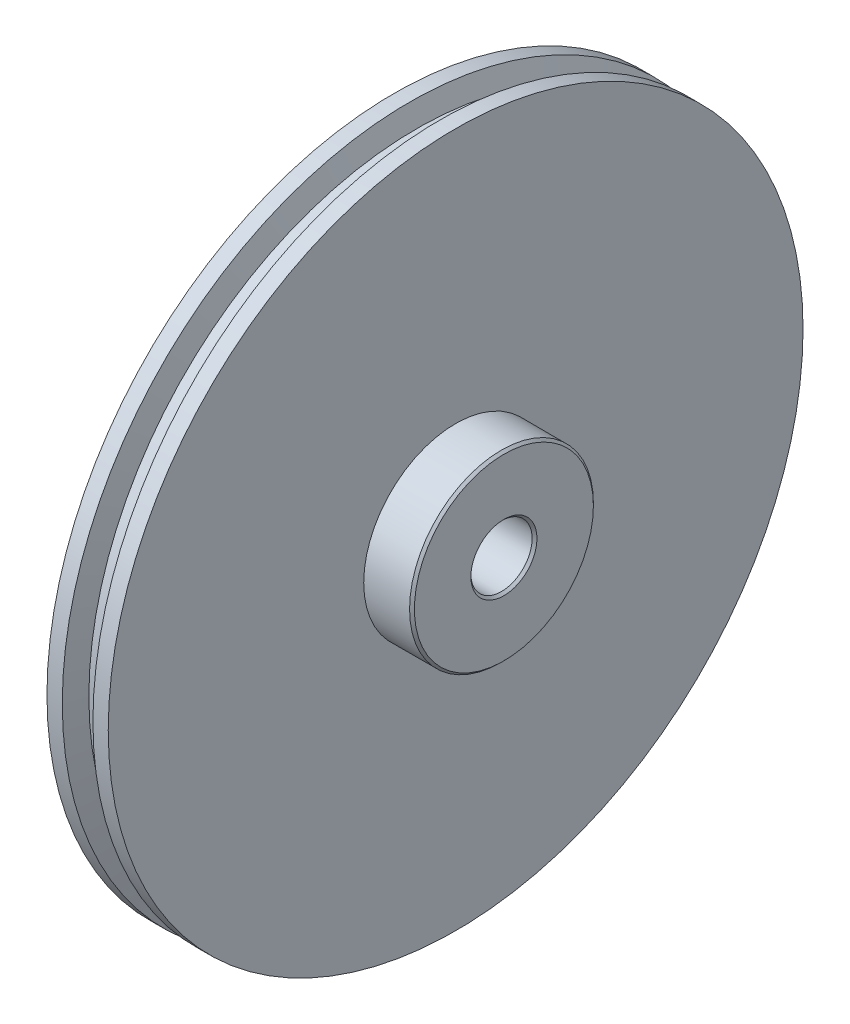
ISO-10303-21;
HEADER;
FILE_DESCRIPTION(('STEP AP214'),'2;1');
FILE_NAME('part.step','',(''),(''),'','','');
FILE_SCHEMA(('AUTOMOTIVE_DESIGN { 1 0 10303 214 1 1 1 1 }'));
ENDSEC;
DATA;
#1=APPLICATION_CONTEXT('core data for automotive mechanical design processes');
#2=APPLICATION_PROTOCOL_DEFINITION('international standard','automotive_design',2000,#1);
#3=PRODUCT_CONTEXT('',#1,'mechanical');
#4=PRODUCT('Part','Part','',(#3));
#5=PRODUCT_RELATED_PRODUCT_CATEGORY('part','',(#4));
#6=PRODUCT_DEFINITION_FORMATION('','',#4);
#7=PRODUCT_DEFINITION_CONTEXT('part definition',#1,'design');
#8=PRODUCT_DEFINITION('design','',#6,#7);
#9=PRODUCT_DEFINITION_SHAPE('','',#8);
#10=(LENGTH_UNIT() NAMED_UNIT(*) SI_UNIT(.MILLI.,.METRE.));
#11=(NAMED_UNIT(*) PLANE_ANGLE_UNIT() SI_UNIT($,.RADIAN.));
#12=(NAMED_UNIT(*) SI_UNIT($,.STERADIAN.) SOLID_ANGLE_UNIT());
#13=UNCERTAINTY_MEASURE_WITH_UNIT(LENGTH_MEASURE(1.E-05),#10,'distance_accuracy_value','');
#14=(GEOMETRIC_REPRESENTATION_CONTEXT(3) GLOBAL_UNCERTAINTY_ASSIGNED_CONTEXT((#13)) GLOBAL_UNIT_ASSIGNED_CONTEXT((#10,
#11,#12)) REPRESENTATION_CONTEXT('',''));
#15=CARTESIAN_POINT('',(0.,0.,0.));
#16=DIRECTION('',(0.,0.,1.));
#17=DIRECTION('',(1.,0.,0.));
#18=AXIS2_PLACEMENT_3D('',#15,#16,#17);
#19=CARTESIAN_POINT('',(3.175,3.175,0.));
#20=DIRECTION('',(-1.,0.,0.));
#21=DIRECTION('',(0.,0.,1.));
#22=AXIS2_PLACEMENT_3D('',#19,#20,#21);
#23=PLANE('',#22);
#24=CARTESIAN_POINT('',(3.175,0.,0.));
#25=DIRECTION('',(-1.,0.,0.));
#26=DIRECTION('',(0.,0.,1.));
#27=AXIS2_PLACEMENT_3D('',#24,#25,#26);
#28=CIRCLE('',#27,36.);
#29=CARTESIAN_POINT('',(3.175,0.,36.));
#30=VERTEX_POINT('',#29);
#31=EDGE_CURVE('E78',#30,#30,#28,.T.);
#32=ORIENTED_EDGE('',*,*,#31,.F.);
#33=EDGE_LOOP('',(#32));
#34=FACE_BOUND('',#33,.T.);
#35=CARTESIAN_POINT('',(3.175,0.,0.));
#36=DIRECTION('',(-1.,0.,0.));
#37=DIRECTION('',(0.,0.,1.));
#38=AXIS2_PLACEMENT_3D('',#35,#36,#37);
#39=CIRCLE('',#38,9.525);
#40=CARTESIAN_POINT('',(3.175,0.,9.525));
#41=VERTEX_POINT('',#40);
#42=EDGE_CURVE('E60',#41,#41,#39,.F.);
#43=ORIENTED_EDGE('',*,*,#42,.F.);
#44=EDGE_LOOP('',(#43));
#45=FACE_BOUND('',#44,.T.);
#46=ADVANCED_FACE('F34',(#34,#45),#23,.F.);
#47=CARTESIAN_POINT('',(-3.175,3.175,0.));
#48=DIRECTION('',(1.,0.,0.));
#49=DIRECTION('',(0.,0.,-1.));
#50=AXIS2_PLACEMENT_3D('',#47,#48,#49);
#51=PLANE('',#50);
#52=CARTESIAN_POINT('',(-3.175,0.,0.));
#53=DIRECTION('',(1.,0.,0.));
#54=DIRECTION('',(0.,0.,-1.));
#55=AXIS2_PLACEMENT_3D('',#52,#53,#54);
#56=CIRCLE('',#55,3.42500000000001);
#57=CARTESIAN_POINT('',(-3.175,0.,-3.42500000000001));
#58=VERTEX_POINT('',#57);
#59=EDGE_CURVE('E49',#58,#58,#56,.T.);
#60=ORIENTED_EDGE('',*,*,#59,.T.);
#61=EDGE_LOOP('',(#60));
#62=FACE_BOUND('',#61,.T.);
#63=CARTESIAN_POINT('',(-3.175,0.,0.));
#64=DIRECTION('',(-1.,0.,0.));
#65=DIRECTION('',(0.,0.,1.));
#66=AXIS2_PLACEMENT_3D('',#63,#64,#65);
#67=CIRCLE('',#66,36.);
#68=CARTESIAN_POINT('',(-3.175,0.,36.));
#69=VERTEX_POINT('',#68);
#70=EDGE_CURVE('E63',#69,#69,#67,.T.);
#71=ORIENTED_EDGE('',*,*,#70,.T.);
#72=EDGE_LOOP('',(#71));
#73=FACE_BOUND('',#72,.T.);
#74=ADVANCED_FACE('F86',(#62,#73),#51,.F.);
#75=CARTESIAN_POINT('',(0.,0.,0.));
#76=DIRECTION('',(-1.,0.,0.));
#77=DIRECTION('',(0.,0.,1.));
#78=AXIS2_PLACEMENT_3D('',#75,#76,#77);
#79=CYLINDRICAL_SURFACE('',#78,36.);
#80=ORIENTED_EDGE('',*,*,#70,.F.);
#81=EDGE_LOOP('',(#80));
#82=FACE_BOUND('',#81,.T.);
#83=CARTESIAN_POINT('',(-1.5875,0.,0.));
#84=DIRECTION('',(-1.,0.,0.));
#85=DIRECTION('',(0.,0.,1.));
#86=AXIS2_PLACEMENT_3D('',#83,#84,#85);
#87=CIRCLE('',#86,36.);
#88=CARTESIAN_POINT('',(-1.5875,0.,36.));
#89=VERTEX_POINT('',#88);
#90=EDGE_CURVE('E66',#89,#89,#87,.T.);
#91=ORIENTED_EDGE('',*,*,#90,.T.);
#92=EDGE_LOOP('',(#91));
#93=FACE_BOUND('',#92,.T.);
#94=ADVANCED_FACE('F118',(#82,#93),#79,.T.);
#95=CARTESIAN_POINT('',(-0.833641219368296,0.,0.));
#96=DIRECTION('',(-1.,0.,0.));
#97=DIRECTION('',(0.,0.,1.));
#98=AXIS2_PLACEMENT_3D('',#95,#96,#97);
#99=CONICAL_SURFACE('',#98,34.,1.21033521014277);
#100=ORIENTED_EDGE('',*,*,#90,.F.);
#101=EDGE_LOOP('',(#100));
#102=FACE_BOUND('',#101,.T.);
#103=CARTESIAN_POINT('',(-0.833641219368296,0.,0.));
#104=DIRECTION('',(-1.,0.,0.));
#105=DIRECTION('',(0.,0.,1.));
#106=AXIS2_PLACEMENT_3D('',#103,#104,#105);
#107=CIRCLE('',#106,34.);
#108=CARTESIAN_POINT('',(-0.833641219368296,0.,34.));
#109=VERTEX_POINT('',#108);
#110=EDGE_CURVE('E69',#109,#109,#107,.T.);
#111=ORIENTED_EDGE('',*,*,#110,.T.);
#112=EDGE_LOOP('',(#111));
#113=FACE_BOUND('',#112,.T.);
#114=ADVANCED_FACE('F114',(#102,#113),#99,.T.);
#115=CARTESIAN_POINT('',(0.,0.,0.));
#116=DIRECTION('',(-1.,0.,0.));
#117=DIRECTION('',(0.,0.,1.));
#118=AXIS2_PLACEMENT_3D('',#115,#116,#117);
#119=CYLINDRICAL_SURFACE('',#118,34.);
#120=ORIENTED_EDGE('',*,*,#110,.F.);
#121=EDGE_LOOP('',(#120));
#122=FACE_BOUND('',#121,.T.);
#123=CARTESIAN_POINT('',(0.833641219368296,0.,0.));
#124=DIRECTION('',(-1.,0.,0.));
#125=DIRECTION('',(0.,0.,1.));
#126=AXIS2_PLACEMENT_3D('',#123,#124,#125);
#127=CIRCLE('',#126,34.);
#128=CARTESIAN_POINT('',(0.833641219368296,0.,34.));
#129=VERTEX_POINT('',#128);
#130=EDGE_CURVE('E72',#129,#129,#127,.T.);
#131=ORIENTED_EDGE('',*,*,#130,.T.);
#132=EDGE_LOOP('',(#131));
#133=FACE_BOUND('',#132,.T.);
#134=ADVANCED_FACE('F110',(#122,#133),#119,.T.);
#135=CARTESIAN_POINT('',(1.5875,0.,0.));
#136=DIRECTION('',(1.,0.,0.));
#137=DIRECTION('',(0.,0.,-1.));
#138=AXIS2_PLACEMENT_3D('',#135,#136,#137);
#139=CONICAL_SURFACE('',#138,36.,1.21033521014277);
#140=ORIENTED_EDGE('',*,*,#130,.F.);
#141=EDGE_LOOP('',(#140));
#142=FACE_BOUND('',#141,.T.);
#143=CARTESIAN_POINT('',(1.5875,0.,0.));
#144=DIRECTION('',(-1.,0.,0.));
#145=DIRECTION('',(0.,0.,1.));
#146=AXIS2_PLACEMENT_3D('',#143,#144,#145);
#147=CIRCLE('',#146,36.);
#148=CARTESIAN_POINT('',(1.5875,0.,36.));
#149=VERTEX_POINT('',#148);
#150=EDGE_CURVE('E75',#149,#149,#147,.T.);
#151=ORIENTED_EDGE('',*,*,#150,.T.);
#152=EDGE_LOOP('',(#151));
#153=FACE_BOUND('',#152,.T.);
#154=ADVANCED_FACE('F106',(#142,#153),#139,.T.);
#155=CARTESIAN_POINT('',(0.,0.,0.));
#156=DIRECTION('',(-1.,0.,0.));
#157=DIRECTION('',(0.,0.,1.));
#158=AXIS2_PLACEMENT_3D('',#155,#156,#157);
#159=CYLINDRICAL_SURFACE('',#158,36.);
#160=ORIENTED_EDGE('',*,*,#150,.F.);
#161=EDGE_LOOP('',(#160));
#162=FACE_BOUND('',#161,.T.);
#163=ORIENTED_EDGE('',*,*,#31,.T.);
#164=EDGE_LOOP('',(#163));
#165=FACE_BOUND('',#164,.T.);
#166=ADVANCED_FACE('F82',(#162,#165),#159,.T.);
#167=CARTESIAN_POINT('',(0.,0.,0.));
#168=DIRECTION('',(-1.,0.,0.));
#169=DIRECTION('',(0.,0.,1.));
#170=AXIS2_PLACEMENT_3D('',#167,#168,#169);
#171=CYLINDRICAL_SURFACE('',#170,3.175);
#172=CARTESIAN_POINT('',(-2.92499999999999,0.,0.));
#173=DIRECTION('',(1.,0.,0.));
#174=DIRECTION('',(0.,0.,-1.));
#175=AXIS2_PLACEMENT_3D('',#172,#173,#174);
#176=CIRCLE('',#175,3.175);
#177=CARTESIAN_POINT('',(-2.92499999999999,0.,-3.175));
#178=VERTEX_POINT('',#177);
#179=EDGE_CURVE('E54',#178,#178,#176,.F.);
#180=ORIENTED_EDGE('',*,*,#179,.T.);
#181=EDGE_LOOP('',(#180));
#182=FACE_BOUND('',#181,.T.);
#183=CARTESIAN_POINT('',(7.92500000000001,0.,0.));
#184=DIRECTION('',(1.,0.,0.));
#185=DIRECTION('',(0.,0.,-1.));
#186=AXIS2_PLACEMENT_3D('',#183,#184,#185);
#187=CIRCLE('',#186,3.175);
#188=CARTESIAN_POINT('',(7.92500000000001,0.,-3.175));
#189=VERTEX_POINT('',#188);
#190=EDGE_CURVE('E57',#189,#189,#187,.T.);
#191=ORIENTED_EDGE('',*,*,#190,.T.);
#192=EDGE_LOOP('',(#191));
#193=FACE_BOUND('',#192,.T.);
#194=ADVANCED_FACE('F93',(#182,#193),#171,.F.);
#195=CARTESIAN_POINT('',(8.175,0.,0.));
#196=DIRECTION('',(-1.,0.,0.));
#197=DIRECTION('',(0.,0.,1.));
#198=AXIS2_PLACEMENT_3D('',#195,#196,#197);
#199=CYLINDRICAL_SURFACE('',#198,9.525);
#200=CARTESIAN_POINT('',(7.925,0.,0.));
#201=DIRECTION('',(1.,0.,0.));
#202=DIRECTION('',(0.,0.,-1.));
#203=AXIS2_PLACEMENT_3D('',#200,#201,#202);
#204=CIRCLE('',#203,9.525);
#205=CARTESIAN_POINT('',(7.925,0.,-9.525));
#206=VERTEX_POINT('',#205);
#207=EDGE_CURVE('E10',#206,#206,#204,.F.);
#208=ORIENTED_EDGE('',*,*,#207,.T.);
#209=EDGE_LOOP('',(#208));
#210=FACE_BOUND('',#209,.T.);
#211=ORIENTED_EDGE('',*,*,#42,.T.);
#212=EDGE_LOOP('',(#211));
#213=FACE_BOUND('',#212,.T.);
#214=ADVANCED_FACE('F90',(#210,#213),#199,.T.);
#215=CARTESIAN_POINT('',(8.175,0.,0.));
#216=DIRECTION('',(1.,0.,0.));
#217=DIRECTION('',(0.,0.,-1.));
#218=AXIS2_PLACEMENT_3D('',#215,#216,#217);
#219=PLANE('',#218);
#220=CARTESIAN_POINT('',(8.175,0.,0.));
#221=DIRECTION('',(1.,0.,0.));
#222=DIRECTION('',(0.,0.,-1.));
#223=AXIS2_PLACEMENT_3D('',#220,#221,#222);
#224=CIRCLE('',#223,3.425);
#225=CARTESIAN_POINT('',(8.175,0.,-3.425));
#226=VERTEX_POINT('',#225);
#227=EDGE_CURVE('E41',#226,#226,#224,.F.);
#228=ORIENTED_EDGE('',*,*,#227,.T.);
#229=EDGE_LOOP('',(#228));
#230=FACE_BOUND('',#229,.T.);
#231=CARTESIAN_POINT('',(8.175,0.,0.));
#232=DIRECTION('',(1.,0.,0.));
#233=DIRECTION('',(0.,0.,-1.));
#234=AXIS2_PLACEMENT_3D('',#231,#232,#233);
#235=CIRCLE('',#234,9.27499999999999);
#236=CARTESIAN_POINT('',(8.175,0.,-9.27499999999999));
#237=VERTEX_POINT('',#236);
#238=EDGE_CURVE('E45',#237,#237,#235,.T.);
#239=ORIENTED_EDGE('',*,*,#238,.T.);
#240=EDGE_LOOP('',(#239));
#241=FACE_BOUND('',#240,.T.);
#242=ADVANCED_FACE('F92',(#230,#241),#219,.T.);
#243=CARTESIAN_POINT('',(-2.92499999999999,0.,0.));
#244=DIRECTION('',(-1.,0.,0.));
#245=DIRECTION('',(0.,0.,1.));
#246=AXIS2_PLACEMENT_3D('',#243,#244,#245);
#247=CONICAL_SURFACE('',#246,3.175,0.785398163397454);
#248=ORIENTED_EDGE('',*,*,#59,.F.);
#249=EDGE_LOOP('',(#248));
#250=FACE_BOUND('',#249,.T.);
#251=ORIENTED_EDGE('',*,*,#179,.F.);
#252=EDGE_LOOP('',(#251));
#253=FACE_BOUND('',#252,.T.);
#254=ADVANCED_FACE('F99',(#250,#253),#247,.F.);
#255=CARTESIAN_POINT('',(7.92500000000001,0.,0.));
#256=DIRECTION('',(1.,0.,0.));
#257=DIRECTION('',(0.,0.,-1.));
#258=AXIS2_PLACEMENT_3D('',#255,#256,#257);
#259=CONICAL_SURFACE('',#258,3.175,0.785398163397466);
#260=ORIENTED_EDGE('',*,*,#227,.F.);
#261=EDGE_LOOP('',(#260));
#262=FACE_BOUND('',#261,.T.);
#263=ORIENTED_EDGE('',*,*,#190,.F.);
#264=EDGE_LOOP('',(#263));
#265=FACE_BOUND('',#264,.T.);
#266=ADVANCED_FACE('F127',(#262,#265),#259,.F.);
#267=CARTESIAN_POINT('',(8.175,0.,0.));
#268=DIRECTION('',(-1.,0.,0.));
#269=DIRECTION('',(0.,0.,1.));
#270=AXIS2_PLACEMENT_3D('',#267,#268,#269);
#271=CONICAL_SURFACE('',#270,9.27499999999999,0.785398163397469);
#272=ORIENTED_EDGE('',*,*,#207,.F.);
#273=EDGE_LOOP('',(#272));
#274=FACE_BOUND('',#273,.T.);
#275=ORIENTED_EDGE('',*,*,#238,.F.);
#276=EDGE_LOOP('',(#275));
#277=FACE_BOUND('',#276,.T.);
#278=ADVANCED_FACE('F36',(#274,#277),#271,.T.);
#279=CLOSED_SHELL('',(#46,#74,#94,#114,#134,#154,#166,#194,#214,#242,#254,#266,#278));
#280=MANIFOLD_SOLID_BREP('B2',#279);
#281=ADVANCED_BREP_SHAPE_REPRESENTATION('',(#18,#280),#14);
#282=SHAPE_DEFINITION_REPRESENTATION(#9,#281);
ENDSEC;
END-ISO-10303-21;
